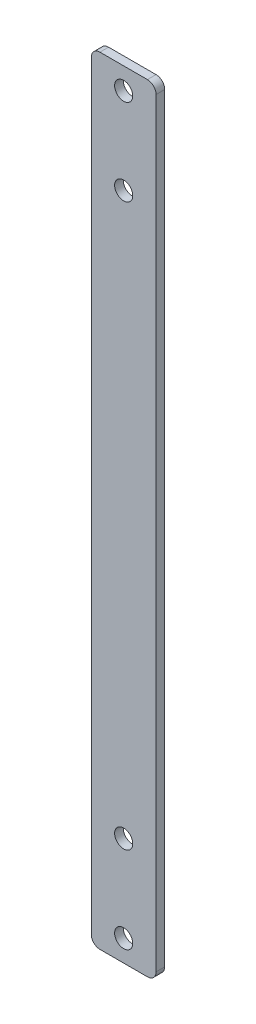
ISO-10303-21;
HEADER;
FILE_DESCRIPTION(('STEP AP214'),'2;1');
FILE_NAME('part.step','',(''),(''),'','','');
FILE_SCHEMA(('AUTOMOTIVE_DESIGN { 1 0 10303 214 1 1 1 1 }'));
ENDSEC;
DATA;
#1=APPLICATION_CONTEXT('core data for automotive mechanical design processes');
#2=APPLICATION_PROTOCOL_DEFINITION('international standard','automotive_design',2000,#1);
#3=PRODUCT_CONTEXT('',#1,'mechanical');
#4=PRODUCT('Part','Part','',(#3));
#5=PRODUCT_RELATED_PRODUCT_CATEGORY('part','',(#4));
#6=PRODUCT_DEFINITION_FORMATION('','',#4);
#7=PRODUCT_DEFINITION_CONTEXT('part definition',#1,'design');
#8=PRODUCT_DEFINITION('design','',#6,#7);
#9=PRODUCT_DEFINITION_SHAPE('','',#8);
#10=(LENGTH_UNIT() NAMED_UNIT(*) SI_UNIT(.MILLI.,.METRE.));
#11=(NAMED_UNIT(*) PLANE_ANGLE_UNIT() SI_UNIT($,.RADIAN.));
#12=(NAMED_UNIT(*) SI_UNIT($,.STERADIAN.) SOLID_ANGLE_UNIT());
#13=UNCERTAINTY_MEASURE_WITH_UNIT(LENGTH_MEASURE(1.E-05),#10,'distance_accuracy_value','');
#14=(GEOMETRIC_REPRESENTATION_CONTEXT(3) GLOBAL_UNCERTAINTY_ASSIGNED_CONTEXT((#13)) GLOBAL_UNIT_ASSIGNED_CONTEXT((#10,
#11,#12)) REPRESENTATION_CONTEXT('',''));
#15=CARTESIAN_POINT('',(0.,0.,0.));
#16=DIRECTION('',(0.,0.,1.));
#17=DIRECTION('',(1.,0.,0.));
#18=AXIS2_PLACEMENT_3D('',#15,#16,#17);
#19=CARTESIAN_POINT('',(-5.50000000000002,173.,2.));
#20=DIRECTION('',(0.,0.,1.));
#21=DIRECTION('',(1.,0.,0.));
#22=AXIS2_PLACEMENT_3D('',#19,#20,#21);
#23=PLANE('',#22);
#24=CARTESIAN_POINT('',(0.,20.,2.));
#25=DIRECTION('',(0.,0.,1.));
#26=DIRECTION('',(1.,0.,0.));
#27=AXIS2_PLACEMENT_3D('',#24,#25,#26);
#28=CIRCLE('',#27,2.1);
#29=CARTESIAN_POINT('',(2.1,20.,2.));
#30=VERTEX_POINT('',#29);
#31=EDGE_CURVE('E312',#30,#30,#28,.F.);
#32=ORIENTED_EDGE('',*,*,#31,.T.);
#33=EDGE_LOOP('',(#32));
#34=FACE_BOUND('',#33,.T.);
#35=CARTESIAN_POINT('',(0.,0.,2.));
#36=DIRECTION('',(0.,0.,1.));
#37=DIRECTION('',(1.,0.,0.));
#38=AXIS2_PLACEMENT_3D('',#35,#36,#37);
#39=CIRCLE('',#38,2.10000000000001);
#40=CARTESIAN_POINT('',(2.09999999999994,0.,2.));
#41=VERTEX_POINT('',#40);
#42=EDGE_CURVE('E306',#41,#41,#39,.F.);
#43=ORIENTED_EDGE('',*,*,#42,.T.);
#44=EDGE_LOOP('',(#43));
#45=FACE_BOUND('',#44,.T.);
#46=CARTESIAN_POINT('',(0.,170.,2.));
#47=DIRECTION('',(0.,0.,1.));
#48=DIRECTION('',(1.,0.,0.));
#49=AXIS2_PLACEMENT_3D('',#46,#47,#48);
#50=CIRCLE('',#49,2.1);
#51=CARTESIAN_POINT('',(2.1,170.,2.));
#52=VERTEX_POINT('',#51);
#53=EDGE_CURVE('E249',#52,#52,#50,.T.);
#54=ORIENTED_EDGE('',*,*,#53,.F.);
#55=EDGE_LOOP('',(#54));
#56=FACE_BOUND('',#55,.T.);
#57=CARTESIAN_POINT('',(-5.50000000000002,173.,2.));
#58=DIRECTION('',(0.,0.,1.));
#59=DIRECTION('',(1.,0.,0.));
#60=AXIS2_PLACEMENT_3D('',#57,#58,#59);
#61=CIRCLE('',#60,2.);
#62=CARTESIAN_POINT('',(-5.50000000000001,175.,2.));
#63=VERTEX_POINT('',#62);
#64=CARTESIAN_POINT('',(-7.50000000000002,173.,2.));
#65=VERTEX_POINT('',#64);
#66=EDGE_CURVE('E264',#63,#65,#61,.T.);
#67=ORIENTED_EDGE('',*,*,#66,.T.);
#68=DIRECTION('',(0.,-1.,0.));
#69=VECTOR('',#68,1.);
#70=CARTESIAN_POINT('',(-7.50000000000002,173.,2.));
#71=LINE('',#70,#69);
#72=CARTESIAN_POINT('',(-7.50000000000006,-3.00000000000004,2.));
#73=VERTEX_POINT('',#72);
#74=EDGE_CURVE('E204',#65,#73,#71,.T.);
#75=ORIENTED_EDGE('',*,*,#74,.T.);
#76=CARTESIAN_POINT('',(-5.50000000000006,-3.00000000000006,2.));
#77=DIRECTION('',(0.,0.,1.));
#78=DIRECTION('',(1.,0.,0.));
#79=AXIS2_PLACEMENT_3D('',#76,#77,#78);
#80=CIRCLE('',#79,2.);
#81=CARTESIAN_POINT('',(-5.50000000000005,-5.00000000000006,2.));
#82=VERTEX_POINT('',#81);
#83=EDGE_CURVE('E279',#73,#82,#80,.T.);
#84=ORIENTED_EDGE('',*,*,#83,.T.);
#85=DIRECTION('',(1.,0.,0.));
#86=VECTOR('',#85,1.);
#87=CARTESIAN_POINT('',(-5.50000000000005,-5.00000000000006,2.));
#88=LINE('',#87,#86);
#89=CARTESIAN_POINT('',(5.5,-5.00000000000008,2.));
#90=VERTEX_POINT('',#89);
#91=EDGE_CURVE('E291',#82,#90,#88,.T.);
#92=ORIENTED_EDGE('',*,*,#91,.T.);
#93=CARTESIAN_POINT('',(5.50000000000002,-3.00000000000008,2.));
#94=DIRECTION('',(0.,0.,1.));
#95=DIRECTION('',(1.,0.,0.));
#96=AXIS2_PLACEMENT_3D('',#93,#94,#95);
#97=CIRCLE('',#96,2.);
#98=CARTESIAN_POINT('',(7.50000000000002,-3.00000000000008,2.));
#99=VERTEX_POINT('',#98);
#100=EDGE_CURVE('E237',#90,#99,#97,.T.);
#101=ORIENTED_EDGE('',*,*,#100,.T.);
#102=DIRECTION('',(0.,-1.,0.));
#103=VECTOR('',#102,1.);
#104=CARTESIAN_POINT('',(7.50000000000002,173.,2.));
#105=LINE('',#104,#103);
#106=CARTESIAN_POINT('',(7.50000000000002,173.,2.));
#107=VERTEX_POINT('',#106);
#108=EDGE_CURVE('E223',#107,#99,#105,.T.);
#109=ORIENTED_EDGE('',*,*,#108,.F.);
#110=CARTESIAN_POINT('',(5.50000000000002,173.,2.));
#111=DIRECTION('',(0.,0.,-1.));
#112=DIRECTION('',(-1.,0.,0.));
#113=AXIS2_PLACEMENT_3D('',#110,#111,#112);
#114=CIRCLE('',#113,2.);
#115=CARTESIAN_POINT('',(5.50000000000001,175.,2.));
#116=VERTEX_POINT('',#115);
#117=EDGE_CURVE('E235',#116,#107,#114,.T.);
#118=ORIENTED_EDGE('',*,*,#117,.F.);
#119=DIRECTION('',(1.,0.,0.));
#120=VECTOR('',#119,1.);
#121=CARTESIAN_POINT('',(-5.50000000000001,175.,2.));
#122=LINE('',#121,#120);
#123=EDGE_CURVE('E241',#63,#116,#122,.T.);
#124=ORIENTED_EDGE('',*,*,#123,.F.);
#125=EDGE_LOOP('',(#67,#75,#84,#92,#101,#109,#118,#124));
#126=FACE_BOUND('',#125,.T.);
#127=CARTESIAN_POINT('',(0.,150.,2.));
#128=DIRECTION('',(0.,0.,1.));
#129=DIRECTION('',(1.,0.,0.));
#130=AXIS2_PLACEMENT_3D('',#127,#128,#129);
#131=CIRCLE('',#130,2.1);
#132=CARTESIAN_POINT('',(2.1,150.,2.));
#133=VERTEX_POINT('',#132);
#134=EDGE_CURVE('E300',#133,#133,#131,.T.);
#135=ORIENTED_EDGE('',*,*,#134,.F.);
#136=EDGE_LOOP('',(#135));
#137=FACE_BOUND('',#136,.T.);
#138=ADVANCED_FACE('F149',(#34,#45,#56,#126,#137),#23,.T.);
#139=CARTESIAN_POINT('',(-5.50000000000002,173.,0.));
#140=DIRECTION('',(0.,0.,1.));
#141=DIRECTION('',(1.,0.,0.));
#142=AXIS2_PLACEMENT_3D('',#139,#140,#141);
#143=PLANE('',#142);
#144=CARTESIAN_POINT('',(0.,20.,0.));
#145=DIRECTION('',(0.,0.,1.));
#146=DIRECTION('',(1.,0.,0.));
#147=AXIS2_PLACEMENT_3D('',#144,#145,#146);
#148=CIRCLE('',#147,2.1);
#149=CARTESIAN_POINT('',(2.1,20.,0.));
#150=VERTEX_POINT('',#149);
#151=EDGE_CURVE('E315',#150,#150,#148,.F.);
#152=ORIENTED_EDGE('',*,*,#151,.F.);
#153=EDGE_LOOP('',(#152));
#154=FACE_BOUND('',#153,.T.);
#155=CARTESIAN_POINT('',(0.,0.,0.));
#156=DIRECTION('',(0.,0.,1.));
#157=DIRECTION('',(1.,0.,0.));
#158=AXIS2_PLACEMENT_3D('',#155,#156,#157);
#159=CIRCLE('',#158,2.10000000000001);
#160=CARTESIAN_POINT('',(2.09999999999994,0.,0.));
#161=VERTEX_POINT('',#160);
#162=EDGE_CURVE('E309',#161,#161,#159,.F.);
#163=ORIENTED_EDGE('',*,*,#162,.F.);
#164=EDGE_LOOP('',(#163));
#165=FACE_BOUND('',#164,.T.);
#166=CARTESIAN_POINT('',(-5.50000000000002,173.,0.));
#167=DIRECTION('',(0.,0.,1.));
#168=DIRECTION('',(1.,0.,0.));
#169=AXIS2_PLACEMENT_3D('',#166,#167,#168);
#170=CIRCLE('',#169,2.);
#171=CARTESIAN_POINT('',(-5.50000000000001,175.,0.));
#172=VERTEX_POINT('',#171);
#173=CARTESIAN_POINT('',(-7.50000000000002,173.,0.));
#174=VERTEX_POINT('',#173);
#175=EDGE_CURVE('E246',#172,#174,#170,.T.);
#176=ORIENTED_EDGE('',*,*,#175,.F.);
#177=DIRECTION('',(1.,0.,0.));
#178=VECTOR('',#177,1.);
#179=CARTESIAN_POINT('',(-5.50000000000001,175.,0.));
#180=LINE('',#179,#178);
#181=CARTESIAN_POINT('',(5.50000000000001,175.,0.));
#182=VERTEX_POINT('',#181);
#183=EDGE_CURVE('E261',#172,#182,#180,.T.);
#184=ORIENTED_EDGE('',*,*,#183,.T.);
#185=CARTESIAN_POINT('',(5.50000000000002,173.,0.));
#186=DIRECTION('',(0.,0.,-1.));
#187=DIRECTION('',(-1.,0.,0.));
#188=AXIS2_PLACEMENT_3D('',#185,#186,#187);
#189=CIRCLE('',#188,2.);
#190=CARTESIAN_POINT('',(7.50000000000002,173.,0.));
#191=VERTEX_POINT('',#190);
#192=EDGE_CURVE('E259',#182,#191,#189,.T.);
#193=ORIENTED_EDGE('',*,*,#192,.T.);
#194=DIRECTION('',(0.,-1.,0.));
#195=VECTOR('',#194,1.);
#196=CARTESIAN_POINT('',(7.50000000000002,173.,0.));
#197=LINE('',#196,#195);
#198=CARTESIAN_POINT('',(7.50000000000002,-3.00000000000008,0.));
#199=VERTEX_POINT('',#198);
#200=EDGE_CURVE('E225',#191,#199,#197,.T.);
#201=ORIENTED_EDGE('',*,*,#200,.T.);
#202=CARTESIAN_POINT('',(5.50000000000002,-3.00000000000008,0.));
#203=DIRECTION('',(0.,0.,1.));
#204=DIRECTION('',(1.,0.,0.));
#205=AXIS2_PLACEMENT_3D('',#202,#203,#204);
#206=CIRCLE('',#205,2.);
#207=CARTESIAN_POINT('',(5.5,-5.00000000000008,0.));
#208=VERTEX_POINT('',#207);
#209=EDGE_CURVE('E255',#208,#199,#206,.T.);
#210=ORIENTED_EDGE('',*,*,#209,.F.);
#211=DIRECTION('',(1.,0.,0.));
#212=VECTOR('',#211,1.);
#213=CARTESIAN_POINT('',(-5.50000000000005,-5.00000000000006,0.));
#214=LINE('',#213,#212);
#215=CARTESIAN_POINT('',(-5.50000000000005,-5.00000000000006,0.));
#216=VERTEX_POINT('',#215);
#217=EDGE_CURVE('E253',#216,#208,#214,.T.);
#218=ORIENTED_EDGE('',*,*,#217,.F.);
#219=CARTESIAN_POINT('',(-5.50000000000006,-3.00000000000006,0.));
#220=DIRECTION('',(0.,0.,1.));
#221=DIRECTION('',(1.,0.,0.));
#222=AXIS2_PLACEMENT_3D('',#219,#220,#221);
#223=CIRCLE('',#222,2.);
#224=CARTESIAN_POINT('',(-7.50000000000006,-3.00000000000004,0.));
#225=VERTEX_POINT('',#224);
#226=EDGE_CURVE('E251',#225,#216,#223,.T.);
#227=ORIENTED_EDGE('',*,*,#226,.F.);
#228=DIRECTION('',(0.,-1.,0.));
#229=VECTOR('',#228,1.);
#230=CARTESIAN_POINT('',(-7.50000000000002,173.,0.));
#231=LINE('',#230,#229);
#232=EDGE_CURVE('E248',#174,#225,#231,.T.);
#233=ORIENTED_EDGE('',*,*,#232,.F.);
#234=EDGE_LOOP('',(#176,#184,#193,#201,#210,#218,#227,#233));
#235=FACE_BOUND('',#234,.T.);
#236=CARTESIAN_POINT('',(0.,170.,0.));
#237=DIRECTION('',(0.,0.,1.));
#238=DIRECTION('',(1.,0.,0.));
#239=AXIS2_PLACEMENT_3D('',#236,#237,#238);
#240=CIRCLE('',#239,2.1);
#241=CARTESIAN_POINT('',(2.1,170.,0.));
#242=VERTEX_POINT('',#241);
#243=EDGE_CURVE('E297',#242,#242,#240,.T.);
#244=ORIENTED_EDGE('',*,*,#243,.T.);
#245=EDGE_LOOP('',(#244));
#246=FACE_BOUND('',#245,.T.);
#247=CARTESIAN_POINT('',(0.,150.,0.));
#248=DIRECTION('',(0.,0.,1.));
#249=DIRECTION('',(1.,0.,0.));
#250=AXIS2_PLACEMENT_3D('',#247,#248,#249);
#251=CIRCLE('',#250,2.1);
#252=CARTESIAN_POINT('',(2.1,150.,0.));
#253=VERTEX_POINT('',#252);
#254=EDGE_CURVE('E303',#253,#253,#251,.T.);
#255=ORIENTED_EDGE('',*,*,#254,.T.);
#256=EDGE_LOOP('',(#255));
#257=FACE_BOUND('',#256,.T.);
#258=ADVANCED_FACE('F282',(#154,#165,#235,#246,#257),#143,.F.);
#259=CARTESIAN_POINT('',(-5.50000000000002,173.,2.));
#260=DIRECTION('',(0.,0.,-1.));
#261=DIRECTION('',(-1.,0.,0.));
#262=AXIS2_PLACEMENT_3D('',#259,#260,#261);
#263=CYLINDRICAL_SURFACE('',#262,2.);
#264=ORIENTED_EDGE('',*,*,#175,.T.);
#265=DIRECTION('',(0.,0.,-1.));
#266=VECTOR('',#265,1.);
#267=CARTESIAN_POINT('',(-7.50000000000002,173.,2.));
#268=LINE('',#267,#266);
#269=EDGE_CURVE('E12',#65,#174,#268,.T.);
#270=ORIENTED_EDGE('',*,*,#269,.F.);
#271=ORIENTED_EDGE('',*,*,#66,.F.);
#272=DIRECTION('',(0.,0.,-1.));
#273=VECTOR('',#272,1.);
#274=CARTESIAN_POINT('',(-5.50000000000001,175.,2.));
#275=LINE('',#274,#273);
#276=EDGE_CURVE('E166',#63,#172,#275,.T.);
#277=ORIENTED_EDGE('',*,*,#276,.T.);
#278=EDGE_LOOP('',(#264,#270,#271,#277));
#279=FACE_BOUND('',#278,.T.);
#280=ADVANCED_FACE('F151',(#279),#263,.T.);
#281=CARTESIAN_POINT('',(-7.50000000000002,173.,2.));
#282=DIRECTION('',(1.,0.,0.));
#283=DIRECTION('',(0.,1.,0.));
#284=AXIS2_PLACEMENT_3D('',#281,#282,#283);
#285=PLANE('',#284);
#286=ORIENTED_EDGE('',*,*,#232,.T.);
#287=DIRECTION('',(0.,0.,-1.));
#288=VECTOR('',#287,1.);
#289=CARTESIAN_POINT('',(-7.50000000000006,-3.00000000000004,2.));
#290=LINE('',#289,#288);
#291=EDGE_CURVE('E158',#73,#225,#290,.T.);
#292=ORIENTED_EDGE('',*,*,#291,.F.);
#293=ORIENTED_EDGE('',*,*,#74,.F.);
#294=ORIENTED_EDGE('',*,*,#269,.T.);
#295=EDGE_LOOP('',(#286,#292,#293,#294));
#296=FACE_BOUND('',#295,.T.);
#297=ADVANCED_FACE('F364',(#296),#285,.F.);
#298=CARTESIAN_POINT('',(-5.50000000000006,-3.00000000000006,2.));
#299=DIRECTION('',(0.,0.,-1.));
#300=DIRECTION('',(-1.,0.,0.));
#301=AXIS2_PLACEMENT_3D('',#298,#299,#300);
#302=CYLINDRICAL_SURFACE('',#301,2.);
#303=ORIENTED_EDGE('',*,*,#226,.T.);
#304=DIRECTION('',(0.,0.,-1.));
#305=VECTOR('',#304,1.);
#306=CARTESIAN_POINT('',(-5.50000000000005,-5.00000000000006,2.));
#307=LINE('',#306,#305);
#308=EDGE_CURVE('E271',#82,#216,#307,.T.);
#309=ORIENTED_EDGE('',*,*,#308,.F.);
#310=ORIENTED_EDGE('',*,*,#83,.F.);
#311=ORIENTED_EDGE('',*,*,#291,.T.);
#312=EDGE_LOOP('',(#303,#309,#310,#311));
#313=FACE_BOUND('',#312,.T.);
#314=ADVANCED_FACE('F277',(#313),#302,.T.);
#315=CARTESIAN_POINT('',(-5.50000000000005,-5.00000000000006,2.));
#316=DIRECTION('',(0.,1.,0.));
#317=DIRECTION('',(-1.,0.,0.));
#318=AXIS2_PLACEMENT_3D('',#315,#316,#317);
#319=PLANE('',#318);
#320=ORIENTED_EDGE('',*,*,#217,.T.);
#321=DIRECTION('',(0.,0.,-1.));
#322=VECTOR('',#321,1.);
#323=CARTESIAN_POINT('',(5.5,-5.00000000000008,2.));
#324=LINE('',#323,#322);
#325=EDGE_CURVE('E268',#90,#208,#324,.T.);
#326=ORIENTED_EDGE('',*,*,#325,.F.);
#327=ORIENTED_EDGE('',*,*,#91,.F.);
#328=ORIENTED_EDGE('',*,*,#308,.T.);
#329=EDGE_LOOP('',(#320,#326,#327,#328));
#330=FACE_BOUND('',#329,.T.);
#331=ADVANCED_FACE('F287',(#330),#319,.F.);
#332=CARTESIAN_POINT('',(5.50000000000002,-3.00000000000008,2.));
#333=DIRECTION('',(0.,0.,-1.));
#334=DIRECTION('',(-1.,0.,0.));
#335=AXIS2_PLACEMENT_3D('',#332,#333,#334);
#336=CYLINDRICAL_SURFACE('',#335,2.);
#337=ORIENTED_EDGE('',*,*,#209,.T.);
#338=DIRECTION('',(0.,0.,-1.));
#339=VECTOR('',#338,1.);
#340=CARTESIAN_POINT('',(7.50000000000002,-3.00000000000008,2.));
#341=LINE('',#340,#339);
#342=EDGE_CURVE('E229',#99,#199,#341,.T.);
#343=ORIENTED_EDGE('',*,*,#342,.F.);
#344=ORIENTED_EDGE('',*,*,#100,.F.);
#345=ORIENTED_EDGE('',*,*,#325,.T.);
#346=EDGE_LOOP('',(#337,#343,#344,#345));
#347=FACE_BOUND('',#346,.T.);
#348=ADVANCED_FACE('F290',(#347),#336,.T.);
#349=CARTESIAN_POINT('',(7.50000000000002,173.,2.));
#350=DIRECTION('',(1.,0.,0.));
#351=DIRECTION('',(0.,0.,-1.));
#352=AXIS2_PLACEMENT_3D('',#349,#350,#351);
#353=PLANE('',#352);
#354=ORIENTED_EDGE('',*,*,#200,.F.);
#355=DIRECTION('',(0.,0.,-1.));
#356=VECTOR('',#355,1.);
#357=CARTESIAN_POINT('',(7.50000000000002,173.,2.));
#358=LINE('',#357,#356);
#359=EDGE_CURVE('E220',#107,#191,#358,.T.);
#360=ORIENTED_EDGE('',*,*,#359,.F.);
#361=ORIENTED_EDGE('',*,*,#108,.T.);
#362=ORIENTED_EDGE('',*,*,#342,.T.);
#363=EDGE_LOOP('',(#354,#360,#361,#362));
#364=FACE_BOUND('',#363,.T.);
#365=ADVANCED_FACE('F222',(#364),#353,.T.);
#366=CARTESIAN_POINT('',(5.50000000000002,173.,2.));
#367=DIRECTION('',(0.,0.,-1.));
#368=DIRECTION('',(-1.,0.,0.));
#369=AXIS2_PLACEMENT_3D('',#366,#367,#368);
#370=CYLINDRICAL_SURFACE('',#369,2.);
#371=ORIENTED_EDGE('',*,*,#192,.F.);
#372=DIRECTION('',(0.,0.,-1.));
#373=VECTOR('',#372,1.);
#374=CARTESIAN_POINT('',(5.50000000000001,175.,2.));
#375=LINE('',#374,#373);
#376=EDGE_CURVE('E192',#116,#182,#375,.T.);
#377=ORIENTED_EDGE('',*,*,#376,.F.);
#378=ORIENTED_EDGE('',*,*,#117,.T.);
#379=ORIENTED_EDGE('',*,*,#359,.T.);
#380=EDGE_LOOP('',(#371,#377,#378,#379));
#381=FACE_BOUND('',#380,.T.);
#382=ADVANCED_FACE('F240',(#381),#370,.T.);
#383=CARTESIAN_POINT('',(-5.50000000000001,175.,2.));
#384=DIRECTION('',(0.,1.,0.));
#385=DIRECTION('',(0.,0.,1.));
#386=AXIS2_PLACEMENT_3D('',#383,#384,#385);
#387=PLANE('',#386);
#388=ORIENTED_EDGE('',*,*,#183,.F.);
#389=ORIENTED_EDGE('',*,*,#276,.F.);
#390=ORIENTED_EDGE('',*,*,#123,.T.);
#391=ORIENTED_EDGE('',*,*,#376,.T.);
#392=EDGE_LOOP('',(#388,#389,#390,#391));
#393=FACE_BOUND('',#392,.T.);
#394=ADVANCED_FACE('F352',(#393),#387,.T.);
#395=CARTESIAN_POINT('',(0.,170.,2.));
#396=DIRECTION('',(0.,0.,-1.));
#397=DIRECTION('',(-1.,0.,0.));
#398=AXIS2_PLACEMENT_3D('',#395,#396,#397);
#399=CYLINDRICAL_SURFACE('',#398,2.1);
#400=ORIENTED_EDGE('',*,*,#53,.T.);
#401=EDGE_LOOP('',(#400));
#402=FACE_BOUND('',#401,.T.);
#403=ORIENTED_EDGE('',*,*,#243,.F.);
#404=EDGE_LOOP('',(#403));
#405=FACE_BOUND('',#404,.T.);
#406=ADVANCED_FACE('F342',(#402,#405),#399,.F.);
#407=CARTESIAN_POINT('',(0.,150.,2.));
#408=DIRECTION('',(0.,0.,-1.));
#409=DIRECTION('',(-1.,0.,0.));
#410=AXIS2_PLACEMENT_3D('',#407,#408,#409);
#411=CYLINDRICAL_SURFACE('',#410,2.1);
#412=ORIENTED_EDGE('',*,*,#134,.T.);
#413=EDGE_LOOP('',(#412));
#414=FACE_BOUND('',#413,.T.);
#415=ORIENTED_EDGE('',*,*,#254,.F.);
#416=EDGE_LOOP('',(#415));
#417=FACE_BOUND('',#416,.T.);
#418=ADVANCED_FACE('F336',(#414,#417),#411,.F.);
#419=CARTESIAN_POINT('',(0.,0.,2.));
#420=DIRECTION('',(0.,0.,-1.));
#421=DIRECTION('',(-1.,0.,0.));
#422=AXIS2_PLACEMENT_3D('',#419,#420,#421);
#423=CYLINDRICAL_SURFACE('',#422,2.10000000000001);
#424=ORIENTED_EDGE('',*,*,#42,.F.);
#425=EDGE_LOOP('',(#424));
#426=FACE_BOUND('',#425,.T.);
#427=ORIENTED_EDGE('',*,*,#162,.T.);
#428=EDGE_LOOP('',(#427));
#429=FACE_BOUND('',#428,.T.);
#430=ADVANCED_FACE('F326',(#426,#429),#423,.F.);
#431=CARTESIAN_POINT('',(0.,20.,2.));
#432=DIRECTION('',(0.,0.,-1.));
#433=DIRECTION('',(-1.,0.,0.));
#434=AXIS2_PLACEMENT_3D('',#431,#432,#433);
#435=CYLINDRICAL_SURFACE('',#434,2.1);
#436=ORIENTED_EDGE('',*,*,#31,.F.);
#437=EDGE_LOOP('',(#436));
#438=FACE_BOUND('',#437,.T.);
#439=ORIENTED_EDGE('',*,*,#151,.T.);
#440=EDGE_LOOP('',(#439));
#441=FACE_BOUND('',#440,.T.);
#442=ADVANCED_FACE('F323',(#438,#441),#435,.F.);
#443=CLOSED_SHELL('',(#138,#258,#280,#297,#314,#331,#348,#365,#382,#394,#406,#418,#430,#442));
#444=MANIFOLD_SOLID_BREP('B2',#443);
#445=ADVANCED_BREP_SHAPE_REPRESENTATION('',(#18,#444),#14);
#446=SHAPE_DEFINITION_REPRESENTATION(#9,#445);
ENDSEC;
END-ISO-10303-21;
